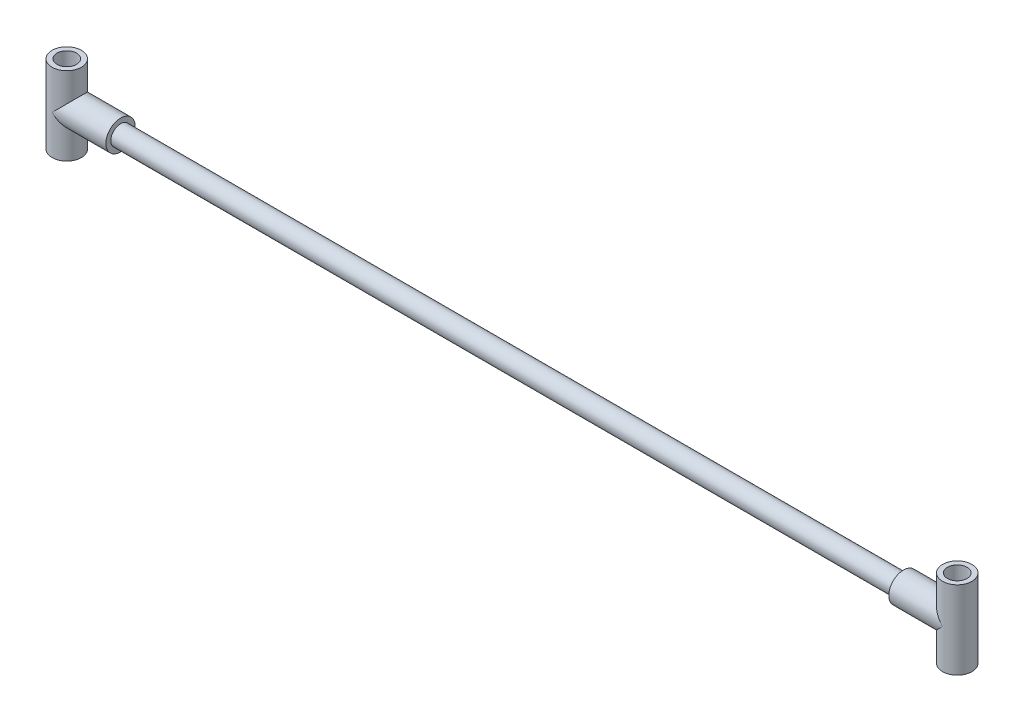
ISO-10303-21;
HEADER;
FILE_DESCRIPTION(('STEP AP214'),'2;1');
FILE_NAME('part.step','',(''),(''),'','','');
FILE_SCHEMA(('AUTOMOTIVE_DESIGN { 1 0 10303 214 1 1 1 1 }'));
ENDSEC;
DATA;
#1=APPLICATION_CONTEXT('core data for automotive mechanical design processes');
#2=APPLICATION_PROTOCOL_DEFINITION('international standard','automotive_design',2000,#1);
#3=PRODUCT_CONTEXT('',#1,'mechanical');
#4=PRODUCT('Part','Part','',(#3));
#5=PRODUCT_RELATED_PRODUCT_CATEGORY('part','',(#4));
#6=PRODUCT_DEFINITION_FORMATION('','',#4);
#7=PRODUCT_DEFINITION_CONTEXT('part definition',#1,'design');
#8=PRODUCT_DEFINITION('design','',#6,#7);
#9=PRODUCT_DEFINITION_SHAPE('','',#8);
#10=(LENGTH_UNIT() NAMED_UNIT(*) SI_UNIT(.MILLI.,.METRE.));
#11=(NAMED_UNIT(*) PLANE_ANGLE_UNIT() SI_UNIT($,.RADIAN.));
#12=(NAMED_UNIT(*) SI_UNIT($,.STERADIAN.) SOLID_ANGLE_UNIT());
#13=UNCERTAINTY_MEASURE_WITH_UNIT(LENGTH_MEASURE(1.E-05),#10,'distance_accuracy_value','');
#14=(GEOMETRIC_REPRESENTATION_CONTEXT(3) GLOBAL_UNCERTAINTY_ASSIGNED_CONTEXT((#13)) GLOBAL_UNIT_ASSIGNED_CONTEXT((#10,
#11,#12)) REPRESENTATION_CONTEXT('',''));
#15=CARTESIAN_POINT('',(0.,0.,0.));
#16=DIRECTION('',(0.,0.,1.));
#17=DIRECTION('',(1.,0.,0.));
#18=AXIS2_PLACEMENT_3D('',#15,#16,#17);
#19=CARTESIAN_POINT('',(227.5,20.,0.));
#20=DIRECTION('',(0.,-1.,0.));
#21=DIRECTION('',(0.,0.,-1.));
#22=AXIS2_PLACEMENT_3D('',#19,#20,#21);
#23=CYLINDRICAL_SURFACE('',#22,7.50000000000001);
#24=CARTESIAN_POINT('',(227.5,-20.,0.));
#25=DIRECTION('',(0.,1.,0.));
#26=DIRECTION('',(0.,0.,1.));
#27=AXIS2_PLACEMENT_3D('',#24,#25,#26);
#28=CIRCLE('',#27,7.50000000000001);
#29=CARTESIAN_POINT('',(227.5,-20.,7.50000000000001));
#30=VERTEX_POINT('',#29);
#31=EDGE_CURVE('E80',#30,#30,#28,.T.);
#32=ORIENTED_EDGE('',*,*,#31,.T.);
#33=EDGE_LOOP('',(#32));
#34=FACE_BOUND('',#33,.T.);
#35=CARTESIAN_POINT('',(227.5,20.,0.));
#36=DIRECTION('',(0.,1.,0.));
#37=DIRECTION('',(0.,0.,1.));
#38=AXIS2_PLACEMENT_3D('',#35,#36,#37);
#39=CIRCLE('',#38,7.50000000000001);
#40=CARTESIAN_POINT('',(227.5,20.,7.50000000000001));
#41=VERTEX_POINT('',#40);
#42=EDGE_CURVE('E81',#41,#41,#39,.T.);
#43=ORIENTED_EDGE('',*,*,#42,.F.);
#44=EDGE_LOOP('',(#43));
#45=FACE_BOUND('',#44,.T.);
#46=CARTESIAN_POINT('',(227.5,0.,0.));
#47=DIRECTION('',(-0.707106781186547,-0.707106781186547,0.));
#48=DIRECTION('',(0.707106781186547,-0.707106781186547,0.));
#49=AXIS2_PLACEMENT_3D('',#46,#47,#48);
#50=ELLIPSE('',#49,10.6066017177982,7.50000000000001);
#51=CARTESIAN_POINT('',(227.5,0.,7.50000000000001));
#52=VERTEX_POINT('',#51);
#53=CARTESIAN_POINT('',(227.5,0.,-7.50000000000001));
#54=VERTEX_POINT('',#53);
#55=EDGE_CURVE('E11',#52,#54,#50,.T.);
#56=ORIENTED_EDGE('',*,*,#55,.F.);
#57=CARTESIAN_POINT('',(227.5,0.,0.));
#58=DIRECTION('',(0.707106781186547,-0.707106781186547,0.));
#59=DIRECTION('',(-0.707106781186547,-0.707106781186547,0.));
#60=AXIS2_PLACEMENT_3D('',#57,#58,#59);
#61=ELLIPSE('',#60,10.6066017177982,7.50000000000001);
#62=EDGE_CURVE('E40',#54,#52,#61,.F.);
#63=ORIENTED_EDGE('',*,*,#62,.F.);
#64=EDGE_LOOP('',(#56,#63));
#65=FACE_BOUND('',#64,.T.);
#66=ADVANCED_FACE('F33',(#34,#45,#65),#23,.T.);
#67=CARTESIAN_POINT('',(227.5,20.,0.));
#68=DIRECTION('',(0.,1.,0.));
#69=DIRECTION('',(0.,0.,1.));
#70=AXIS2_PLACEMENT_3D('',#67,#68,#69);
#71=PLANE('',#70);
#72=CARTESIAN_POINT('',(227.5,20.,0.));
#73=DIRECTION('',(0.,1.,0.));
#74=DIRECTION('',(0.,0.,1.));
#75=AXIS2_PLACEMENT_3D('',#72,#73,#74);
#76=CIRCLE('',#75,5.00000000000002);
#77=CARTESIAN_POINT('',(227.5,20.,5.00000000000002));
#78=VERTEX_POINT('',#77);
#79=EDGE_CURVE('E116',#78,#78,#76,.T.);
#80=ORIENTED_EDGE('',*,*,#79,.F.);
#81=EDGE_LOOP('',(#80));
#82=FACE_BOUND('',#81,.T.);
#83=ORIENTED_EDGE('',*,*,#42,.T.);
#84=EDGE_LOOP('',(#83));
#85=FACE_BOUND('',#84,.T.);
#86=ADVANCED_FACE('F98',(#82,#85),#71,.T.);
#87=CARTESIAN_POINT('',(227.5,-20.,0.));
#88=DIRECTION('',(0.,1.,0.));
#89=DIRECTION('',(0.,0.,1.));
#90=AXIS2_PLACEMENT_3D('',#87,#88,#89);
#91=PLANE('',#90);
#92=CARTESIAN_POINT('',(227.5,-20.,0.));
#93=DIRECTION('',(0.,1.,0.));
#94=DIRECTION('',(0.,0.,1.));
#95=AXIS2_PLACEMENT_3D('',#92,#93,#94);
#96=CIRCLE('',#95,5.00000000000002);
#97=CARTESIAN_POINT('',(227.5,-20.,5.00000000000002));
#98=VERTEX_POINT('',#97);
#99=EDGE_CURVE('E118',#98,#98,#96,.T.);
#100=ORIENTED_EDGE('',*,*,#99,.T.);
#101=EDGE_LOOP('',(#100));
#102=FACE_BOUND('',#101,.T.);
#103=ORIENTED_EDGE('',*,*,#31,.F.);
#104=EDGE_LOOP('',(#103));
#105=FACE_BOUND('',#104,.T.);
#106=ADVANCED_FACE('F89',(#102,#105),#91,.F.);
#107=CARTESIAN_POINT('',(227.5,0.,0.));
#108=DIRECTION('',(-1.,0.,0.));
#109=DIRECTION('',(0.,0.,1.));
#110=AXIS2_PLACEMENT_3D('',#107,#108,#109);
#111=CYLINDRICAL_SURFACE('',#110,7.5);
#112=CARTESIAN_POINT('',(200.,0.,0.));
#113=DIRECTION('',(1.,0.,0.));
#114=DIRECTION('',(0.,0.,-1.));
#115=AXIS2_PLACEMENT_3D('',#112,#113,#114);
#116=CIRCLE('',#115,7.5);
#117=CARTESIAN_POINT('',(200.,0.,-7.5));
#118=VERTEX_POINT('',#117);
#119=EDGE_CURVE('E75',#118,#118,#116,.T.);
#120=ORIENTED_EDGE('',*,*,#119,.T.);
#121=EDGE_LOOP('',(#120));
#122=FACE_BOUND('',#121,.T.);
#123=ORIENTED_EDGE('',*,*,#62,.T.);
#124=ORIENTED_EDGE('',*,*,#55,.T.);
#125=EDGE_LOOP('',(#123,#124));
#126=FACE_BOUND('',#125,.T.);
#127=ADVANCED_FACE('F86',(#122,#126),#111,.T.);
#128=CARTESIAN_POINT('',(200.,0.,0.));
#129=DIRECTION('',(1.,0.,0.));
#130=DIRECTION('',(0.,0.,-1.));
#131=AXIS2_PLACEMENT_3D('',#128,#129,#130);
#132=PLANE('',#131);
#133=CARTESIAN_POINT('',(200.,0.,0.));
#134=DIRECTION('',(1.,0.,0.));
#135=DIRECTION('',(0.,0.,-1.));
#136=AXIS2_PLACEMENT_3D('',#133,#134,#135);
#137=CIRCLE('',#136,5.);
#138=CARTESIAN_POINT('',(200.,0.,-5.));
#139=VERTEX_POINT('',#138);
#140=EDGE_CURVE('E72',#139,#139,#137,.T.);
#141=ORIENTED_EDGE('',*,*,#140,.T.);
#142=EDGE_LOOP('',(#141));
#143=FACE_BOUND('',#142,.T.);
#144=ORIENTED_EDGE('',*,*,#119,.F.);
#145=EDGE_LOOP('',(#144));
#146=FACE_BOUND('',#145,.T.);
#147=ADVANCED_FACE('F88',(#143,#146),#132,.F.);
#148=CARTESIAN_POINT('',(-227.5,0.,0.));
#149=DIRECTION('',(1.,0.,0.));
#150=DIRECTION('',(0.,0.,-1.));
#151=AXIS2_PLACEMENT_3D('',#148,#149,#150);
#152=CYLINDRICAL_SURFACE('',#151,7.5);
#153=CARTESIAN_POINT('',(-200.,0.,0.));
#154=DIRECTION('',(-1.,0.,0.));
#155=DIRECTION('',(0.,0.,1.));
#156=AXIS2_PLACEMENT_3D('',#153,#154,#155);
#157=CIRCLE('',#156,7.5);
#158=CARTESIAN_POINT('',(-200.,0.,7.5));
#159=VERTEX_POINT('',#158);
#160=EDGE_CURVE('E59',#159,#159,#157,.T.);
#161=ORIENTED_EDGE('',*,*,#160,.T.);
#162=EDGE_LOOP('',(#161));
#163=FACE_BOUND('',#162,.T.);
#164=CARTESIAN_POINT('',(-227.5,0.,0.));
#165=DIRECTION('',(0.707106781186547,-0.707106781186547,0.));
#166=DIRECTION('',(0.707106781186547,0.707106781186547,0.));
#167=AXIS2_PLACEMENT_3D('',#164,#165,#166);
#168=ELLIPSE('',#167,10.6066017177982,7.50000000000001);
#169=CARTESIAN_POINT('',(-227.5,0.,7.50000000000001));
#170=VERTEX_POINT('',#169);
#171=CARTESIAN_POINT('',(-227.5,0.,-7.50000000000001));
#172=VERTEX_POINT('',#171);
#173=EDGE_CURVE('E54',#170,#172,#168,.F.);
#174=ORIENTED_EDGE('',*,*,#173,.F.);
#175=CARTESIAN_POINT('',(-227.5,0.,0.));
#176=DIRECTION('',(0.707106781186547,0.707106781186547,0.));
#177=DIRECTION('',(0.707106781186547,-0.707106781186547,0.));
#178=AXIS2_PLACEMENT_3D('',#175,#176,#177);
#179=ELLIPSE('',#178,10.6066017177982,7.50000000000001);
#180=EDGE_CURVE('E57',#172,#170,#179,.F.);
#181=ORIENTED_EDGE('',*,*,#180,.F.);
#182=EDGE_LOOP('',(#174,#181));
#183=FACE_BOUND('',#182,.T.);
#184=ADVANCED_FACE('F56',(#163,#183),#152,.T.);
#185=CARTESIAN_POINT('',(200.,0.,0.));
#186=DIRECTION('',(-1.,0.,0.));
#187=DIRECTION('',(0.,0.,1.));
#188=AXIS2_PLACEMENT_3D('',#185,#186,#187);
#189=CYLINDRICAL_SURFACE('',#188,5.);
#190=ORIENTED_EDGE('',*,*,#140,.F.);
#191=EDGE_LOOP('',(#190));
#192=FACE_BOUND('',#191,.T.);
#193=CARTESIAN_POINT('',(-200.,0.,0.));
#194=DIRECTION('',(1.,0.,0.));
#195=DIRECTION('',(0.,0.,-1.));
#196=AXIS2_PLACEMENT_3D('',#193,#194,#195);
#197=CIRCLE('',#196,5.);
#198=CARTESIAN_POINT('',(-200.,0.,-5.));
#199=VERTEX_POINT('',#198);
#200=EDGE_CURVE('E71',#199,#199,#197,.T.);
#201=ORIENTED_EDGE('',*,*,#200,.T.);
#202=EDGE_LOOP('',(#201));
#203=FACE_BOUND('',#202,.T.);
#204=ADVANCED_FACE('F158',(#192,#203),#189,.T.);
#205=CARTESIAN_POINT('',(-200.,0.,0.));
#206=DIRECTION('',(-1.,0.,0.));
#207=DIRECTION('',(0.,0.,1.));
#208=AXIS2_PLACEMENT_3D('',#205,#206,#207);
#209=PLANE('',#208);
#210=ORIENTED_EDGE('',*,*,#200,.F.);
#211=EDGE_LOOP('',(#210));
#212=FACE_BOUND('',#211,.T.);
#213=ORIENTED_EDGE('',*,*,#160,.F.);
#214=EDGE_LOOP('',(#213));
#215=FACE_BOUND('',#214,.T.);
#216=ADVANCED_FACE('F141',(#212,#215),#209,.F.);
#217=CARTESIAN_POINT('',(-227.5,20.,0.));
#218=DIRECTION('',(0.,-1.,0.));
#219=DIRECTION('',(0.,0.,-1.));
#220=AXIS2_PLACEMENT_3D('',#217,#218,#219);
#221=CYLINDRICAL_SURFACE('',#220,7.50000000000001);
#222=CARTESIAN_POINT('',(-227.5,20.,0.));
#223=DIRECTION('',(0.,1.,0.));
#224=DIRECTION('',(0.,0.,-1.));
#225=AXIS2_PLACEMENT_3D('',#222,#223,#224);
#226=CIRCLE('',#225,7.50000000000001);
#227=CARTESIAN_POINT('',(-227.5,20.,-7.50000000000001));
#228=VERTEX_POINT('',#227);
#229=EDGE_CURVE('E62',#228,#228,#226,.T.);
#230=ORIENTED_EDGE('',*,*,#229,.F.);
#231=EDGE_LOOP('',(#230));
#232=FACE_BOUND('',#231,.T.);
#233=CARTESIAN_POINT('',(-227.5,-20.,0.));
#234=DIRECTION('',(0.,1.,0.));
#235=DIRECTION('',(0.,0.,-1.));
#236=AXIS2_PLACEMENT_3D('',#233,#234,#235);
#237=CIRCLE('',#236,7.50000000000001);
#238=CARTESIAN_POINT('',(-227.5,-20.,-7.50000000000001));
#239=VERTEX_POINT('',#238);
#240=EDGE_CURVE('E65',#239,#239,#237,.T.);
#241=ORIENTED_EDGE('',*,*,#240,.T.);
#242=EDGE_LOOP('',(#241));
#243=FACE_BOUND('',#242,.T.);
#244=ORIENTED_EDGE('',*,*,#180,.T.);
#245=ORIENTED_EDGE('',*,*,#173,.T.);
#246=EDGE_LOOP('',(#244,#245));
#247=FACE_BOUND('',#246,.T.);
#248=ADVANCED_FACE('F61',(#232,#243,#247),#221,.T.);
#249=CARTESIAN_POINT('',(-227.5,20.,0.));
#250=DIRECTION('',(0.,-1.,0.));
#251=DIRECTION('',(0.,0.,-1.));
#252=AXIS2_PLACEMENT_3D('',#249,#250,#251);
#253=PLANE('',#252);
#254=CARTESIAN_POINT('',(-227.5,20.,0.));
#255=DIRECTION('',(0.,1.,0.));
#256=DIRECTION('',(0.,0.,-1.));
#257=AXIS2_PLACEMENT_3D('',#254,#255,#256);
#258=CIRCLE('',#257,5.00000000000002);
#259=CARTESIAN_POINT('',(-227.5,20.,-5.00000000000002));
#260=VERTEX_POINT('',#259);
#261=EDGE_CURVE('E124',#260,#260,#258,.T.);
#262=ORIENTED_EDGE('',*,*,#261,.F.);
#263=EDGE_LOOP('',(#262));
#264=FACE_BOUND('',#263,.T.);
#265=ORIENTED_EDGE('',*,*,#229,.T.);
#266=EDGE_LOOP('',(#265));
#267=FACE_BOUND('',#266,.T.);
#268=ADVANCED_FACE('F132',(#264,#267),#253,.F.);
#269=CARTESIAN_POINT('',(-227.5,-20.,0.));
#270=DIRECTION('',(0.,-1.,0.));
#271=DIRECTION('',(0.,0.,-1.));
#272=AXIS2_PLACEMENT_3D('',#269,#270,#271);
#273=PLANE('',#272);
#274=CARTESIAN_POINT('',(-227.5,-20.,0.));
#275=DIRECTION('',(0.,1.,0.));
#276=DIRECTION('',(0.,0.,-1.));
#277=AXIS2_PLACEMENT_3D('',#274,#275,#276);
#278=CIRCLE('',#277,5.00000000000002);
#279=CARTESIAN_POINT('',(-227.5,-20.,-5.00000000000002));
#280=VERTEX_POINT('',#279);
#281=EDGE_CURVE('E119',#280,#280,#278,.T.);
#282=ORIENTED_EDGE('',*,*,#281,.T.);
#283=EDGE_LOOP('',(#282));
#284=FACE_BOUND('',#283,.T.);
#285=ORIENTED_EDGE('',*,*,#240,.F.);
#286=EDGE_LOOP('',(#285));
#287=FACE_BOUND('',#286,.T.);
#288=ADVANCED_FACE('F135',(#284,#287),#273,.T.);
#289=CARTESIAN_POINT('',(-227.5,-20.,0.));
#290=DIRECTION('',(0.,1.,0.));
#291=DIRECTION('',(0.,0.,1.));
#292=AXIS2_PLACEMENT_3D('',#289,#290,#291);
#293=CYLINDRICAL_SURFACE('',#292,5.00000000000002);
#294=ORIENTED_EDGE('',*,*,#281,.F.);
#295=EDGE_LOOP('',(#294));
#296=FACE_BOUND('',#295,.T.);
#297=ORIENTED_EDGE('',*,*,#261,.T.);
#298=EDGE_LOOP('',(#297));
#299=FACE_BOUND('',#298,.T.);
#300=ADVANCED_FACE('F130',(#296,#299),#293,.F.);
#301=CARTESIAN_POINT('',(227.5,-20.,0.));
#302=DIRECTION('',(0.,1.,0.));
#303=DIRECTION('',(0.,0.,1.));
#304=AXIS2_PLACEMENT_3D('',#301,#302,#303);
#305=CYLINDRICAL_SURFACE('',#304,5.00000000000002);
#306=ORIENTED_EDGE('',*,*,#99,.F.);
#307=EDGE_LOOP('',(#306));
#308=FACE_BOUND('',#307,.T.);
#309=ORIENTED_EDGE('',*,*,#79,.T.);
#310=EDGE_LOOP('',(#309));
#311=FACE_BOUND('',#310,.T.);
#312=ADVANCED_FACE('F152',(#308,#311),#305,.F.);
#313=CLOSED_SHELL('',(#66,#86,#106,#127,#147,#184,#204,#216,#248,#268,#288,#300,#312));
#314=MANIFOLD_SOLID_BREP('B2',#313);
#315=ADVANCED_BREP_SHAPE_REPRESENTATION('',(#18,#314),#14);
#316=SHAPE_DEFINITION_REPRESENTATION(#9,#315);
ENDSEC;
END-ISO-10303-21;
